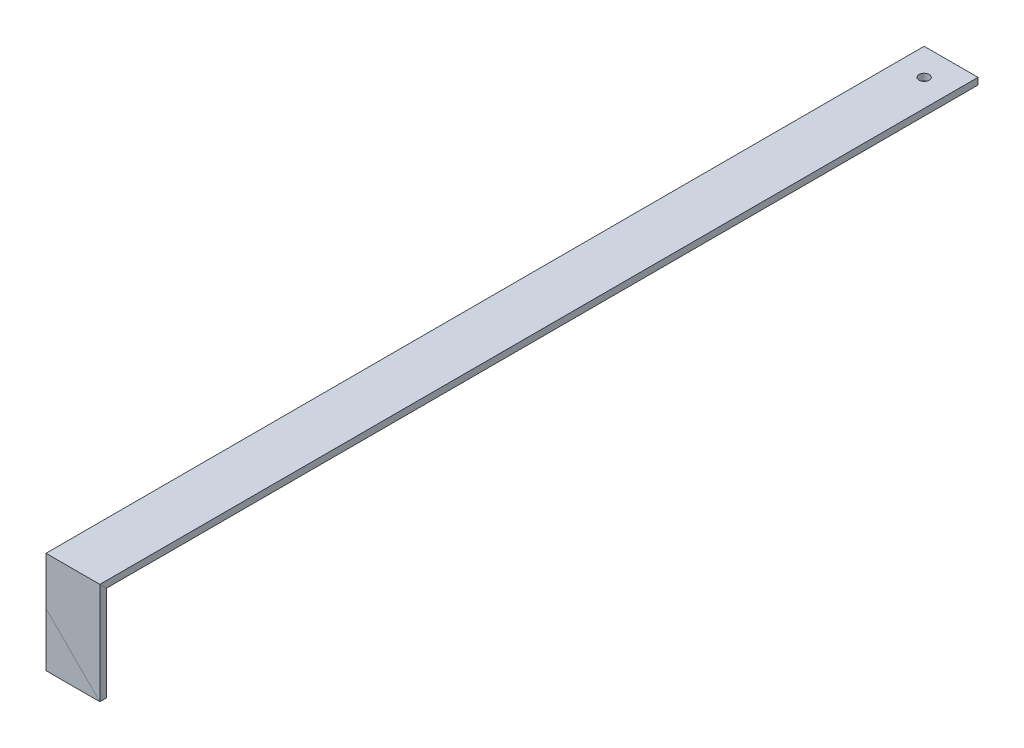
ISO-10303-21;
HEADER;
FILE_DESCRIPTION(('STEP AP214'),'2;1');
FILE_NAME('part.step','',(''),(''),'','','');
FILE_SCHEMA(('AUTOMOTIVE_DESIGN { 1 0 10303 214 1 1 1 1 }'));
ENDSEC;
DATA;
#1=APPLICATION_CONTEXT('core data for automotive mechanical design processes');
#2=APPLICATION_PROTOCOL_DEFINITION('international standard','automotive_design',2000,#1);
#3=PRODUCT_CONTEXT('',#1,'mechanical');
#4=PRODUCT('Part','Part','',(#3));
#5=PRODUCT_RELATED_PRODUCT_CATEGORY('part','',(#4));
#6=PRODUCT_DEFINITION_FORMATION('','',#4);
#7=PRODUCT_DEFINITION_CONTEXT('part definition',#1,'design');
#8=PRODUCT_DEFINITION('design','',#6,#7);
#9=PRODUCT_DEFINITION_SHAPE('','',#8);
#10=(LENGTH_UNIT() NAMED_UNIT(*) SI_UNIT(.MILLI.,.METRE.));
#11=(NAMED_UNIT(*) PLANE_ANGLE_UNIT() SI_UNIT($,.RADIAN.));
#12=(NAMED_UNIT(*) SI_UNIT($,.STERADIAN.) SOLID_ANGLE_UNIT());
#13=UNCERTAINTY_MEASURE_WITH_UNIT(LENGTH_MEASURE(1.E-05),#10,'distance_accuracy_value','');
#14=(GEOMETRIC_REPRESENTATION_CONTEXT(3) GLOBAL_UNCERTAINTY_ASSIGNED_CONTEXT((#13)) GLOBAL_UNIT_ASSIGNED_CONTEXT((#10,
#11,#12)) REPRESENTATION_CONTEXT('',''));
#15=CARTESIAN_POINT('',(0.,0.,0.));
#16=DIRECTION('',(0.,0.,1.));
#17=DIRECTION('',(1.,0.,0.));
#18=AXIS2_PLACEMENT_3D('',#15,#16,#17);
#19=CARTESIAN_POINT('',(28.0399999999999,-41.98,888.575));
#20=DIRECTION('',(0.,0.,-1.));
#21=DIRECTION('',(-1.,0.,0.));
#22=AXIS2_PLACEMENT_3D('',#19,#20,#21);
#23=PLANE('',#22);
#24=DIRECTION('',(0.,-1.,0.));
#25=VECTOR('',#24,1.);
#26=CARTESIAN_POINT('',(-25.4,-41.98,888.575));
#27=LINE('',#26,#25);
#28=CARTESIAN_POINT('',(-25.4,-41.98,888.575));
#29=VERTEX_POINT('',#28);
#30=CARTESIAN_POINT('',(-25.4,-92.78,888.575));
#31=VERTEX_POINT('',#30);
#32=EDGE_CURVE('E149',#29,#31,#27,.T.);
#33=ORIENTED_EDGE('',*,*,#32,.F.);
#34=DIRECTION('',(-0.707106781186548,0.707106781186548,0.));
#35=VECTOR('',#34,1.);
#36=CARTESIAN_POINT('',(-48.1752499999999,-19.2047500000001,888.575));
#37=LINE('',#36,#35);
#38=CARTESIAN_POINT('',(25.4,-92.78,888.575));
#39=VERTEX_POINT('',#38);
#40=EDGE_CURVE('E77',#39,#29,#37,.T.);
#41=ORIENTED_EDGE('',*,*,#40,.F.);
#42=DIRECTION('',(-1.,0.,0.));
#43=VECTOR('',#42,1.);
#44=CARTESIAN_POINT('',(28.04,-92.78,888.575));
#45=LINE('',#44,#43);
#46=EDGE_CURVE('E137',#39,#31,#45,.T.);
#47=ORIENTED_EDGE('',*,*,#46,.T.);
#48=EDGE_LOOP('',(#33,#41,#47));
#49=FACE_BOUND('',#48,.T.);
#50=ADVANCED_FACE('F34',(#49),#23,.T.);
#51=CARTESIAN_POINT('',(28.04,-92.78,894.885));
#52=DIRECTION('',(0.,-1.,0.));
#53=DIRECTION('',(0.,0.,-1.));
#54=AXIS2_PLACEMENT_3D('',#51,#52,#53);
#55=PLANE('',#54);
#56=DIRECTION('',(0.,0.,-1.));
#57=VECTOR('',#56,1.);
#58=CARTESIAN_POINT('',(-25.4,-92.78,894.885));
#59=LINE('',#58,#57);
#60=CARTESIAN_POINT('',(-25.4,-92.78,894.885));
#61=VERTEX_POINT('',#60);
#62=EDGE_CURVE('E148',#61,#31,#59,.T.);
#63=ORIENTED_EDGE('',*,*,#62,.T.);
#64=ORIENTED_EDGE('',*,*,#46,.F.);
#65=DIRECTION('',(0.,0.,-1.));
#66=VECTOR('',#65,1.);
#67=CARTESIAN_POINT('',(25.4,-92.78,894.885));
#68=LINE('',#67,#66);
#69=CARTESIAN_POINT('',(25.4,-92.78,894.885));
#70=VERTEX_POINT('',#69);
#71=EDGE_CURVE('E119',#70,#39,#68,.T.);
#72=ORIENTED_EDGE('',*,*,#71,.F.);
#73=DIRECTION('',(-1.,0.,0.));
#74=VECTOR('',#73,1.);
#75=CARTESIAN_POINT('',(28.04,-92.78,894.885));
#76=LINE('',#75,#74);
#77=EDGE_CURVE('E145',#70,#61,#76,.T.);
#78=ORIENTED_EDGE('',*,*,#77,.T.);
#79=EDGE_LOOP('',(#63,#64,#72,#78));
#80=FACE_BOUND('',#79,.T.);
#81=ADVANCED_FACE('F152',(#80),#55,.T.);
#82=CARTESIAN_POINT('',(28.04,-41.98,894.885));
#83=DIRECTION('',(0.,0.,1.));
#84=DIRECTION('',(1.,0.,0.));
#85=AXIS2_PLACEMENT_3D('',#82,#83,#84);
#86=PLANE('',#85);
#87=DIRECTION('',(0.,-1.,0.));
#88=VECTOR('',#87,1.);
#89=CARTESIAN_POINT('',(-25.4,-41.98,894.885));
#90=LINE('',#89,#88);
#91=CARTESIAN_POINT('',(-25.4,-41.98,894.885));
#92=VERTEX_POINT('',#91);
#93=EDGE_CURVE('E174',#92,#61,#90,.T.);
#94=ORIENTED_EDGE('',*,*,#93,.T.);
#95=ORIENTED_EDGE('',*,*,#77,.F.);
#96=DIRECTION('',(0.707106781186548,-0.707106781186548,0.));
#97=VECTOR('',#96,1.);
#98=CARTESIAN_POINT('',(-48.1752499999999,-19.2047500000001,894.885));
#99=LINE('',#98,#97);
#100=EDGE_CURVE('E129',#92,#70,#99,.T.);
#101=ORIENTED_EDGE('',*,*,#100,.F.);
#102=EDGE_LOOP('',(#94,#95,#101));
#103=FACE_BOUND('',#102,.T.);
#104=ADVANCED_FACE('F36',(#103),#86,.T.);
#105=CARTESIAN_POINT('',(-25.4,3.57049999999988,894.885));
#106=DIRECTION('',(0.,0.,1.));
#107=DIRECTION('',(1.,0.,0.));
#108=AXIS2_PLACEMENT_3D('',#105,#106,#107);
#109=PLANE('',#108);
#110=DIRECTION('',(0.,-1.,0.));
#111=VECTOR('',#110,1.);
#112=CARTESIAN_POINT('',(-25.4,3.57049999999988,894.885));
#113=LINE('',#112,#111);
#114=CARTESIAN_POINT('',(-25.4,3.155,894.885));
#115=VERTEX_POINT('',#114);
#116=EDGE_CURVE('E132',#115,#92,#113,.T.);
#117=ORIENTED_EDGE('',*,*,#116,.T.);
#118=ORIENTED_EDGE('',*,*,#100,.T.);
#119=DIRECTION('',(0.,-1.,0.));
#120=VECTOR('',#119,1.);
#121=CARTESIAN_POINT('',(25.4,3.57049999999988,894.885));
#122=LINE('',#121,#120);
#123=CARTESIAN_POINT('',(25.4,3.155,894.885));
#124=VERTEX_POINT('',#123);
#125=EDGE_CURVE('E133',#124,#70,#122,.T.);
#126=ORIENTED_EDGE('',*,*,#125,.F.);
#127=DIRECTION('',(1.,0.,0.));
#128=VECTOR('',#127,1.);
#129=CARTESIAN_POINT('',(-25.4,3.155,894.885));
#130=LINE('',#129,#128);
#131=EDGE_CURVE('E125',#115,#124,#130,.T.);
#132=ORIENTED_EDGE('',*,*,#131,.F.);
#133=EDGE_LOOP('',(#117,#118,#126,#132));
#134=FACE_BOUND('',#133,.T.);
#135=ADVANCED_FACE('F170',(#134),#109,.T.);
#136=CARTESIAN_POINT('',(25.4,3.57049999999988,894.885));
#137=DIRECTION('',(1.,0.,0.));
#138=DIRECTION('',(0.,0.,-1.));
#139=AXIS2_PLACEMENT_3D('',#136,#137,#138);
#140=PLANE('',#139);
#141=ORIENTED_EDGE('',*,*,#125,.T.);
#142=ORIENTED_EDGE('',*,*,#71,.T.);
#143=DIRECTION('',(0.,-1.,0.));
#144=VECTOR('',#143,1.);
#145=CARTESIAN_POINT('',(25.4,3.57049999999988,888.575));
#146=LINE('',#145,#144);
#147=CARTESIAN_POINT('',(25.4,-3.15500000000007,888.575));
#148=VERTEX_POINT('',#147);
#149=EDGE_CURVE('E136',#148,#39,#146,.T.);
#150=ORIENTED_EDGE('',*,*,#149,.F.);
#151=DIRECTION('',(0.,-0.707106781186548,-0.707106781186548));
#152=VECTOR('',#151,1.);
#153=CARTESIAN_POINT('',(25.4,-444.2875,447.4425));
#154=LINE('',#153,#152);
#155=EDGE_CURVE('E163',#124,#148,#154,.T.);
#156=ORIENTED_EDGE('',*,*,#155,.F.);
#157=EDGE_LOOP('',(#141,#142,#150,#156));
#158=FACE_BOUND('',#157,.T.);
#159=ADVANCED_FACE('F156',(#158),#140,.T.);
#160=CARTESIAN_POINT('',(-25.4,3.57049999999988,888.575));
#161=DIRECTION('',(0.,0.,-1.));
#162=DIRECTION('',(-1.,0.,0.));
#163=AXIS2_PLACEMENT_3D('',#160,#161,#162);
#164=PLANE('',#163);
#165=ORIENTED_EDGE('',*,*,#149,.T.);
#166=ORIENTED_EDGE('',*,*,#40,.T.);
#167=DIRECTION('',(0.,-1.,0.));
#168=VECTOR('',#167,1.);
#169=CARTESIAN_POINT('',(-25.4,3.57049999999988,888.575));
#170=LINE('',#169,#168);
#171=CARTESIAN_POINT('',(-25.4,-3.15500000000004,888.575));
#172=VERTEX_POINT('',#171);
#173=EDGE_CURVE('E140',#172,#29,#170,.T.);
#174=ORIENTED_EDGE('',*,*,#173,.F.);
#175=DIRECTION('',(-1.,0.,0.));
#176=VECTOR('',#175,1.);
#177=CARTESIAN_POINT('',(-25.4,-3.155,888.575));
#178=LINE('',#177,#176);
#179=EDGE_CURVE('E43',#148,#172,#178,.T.);
#180=ORIENTED_EDGE('',*,*,#179,.F.);
#181=EDGE_LOOP('',(#165,#166,#174,#180));
#182=FACE_BOUND('',#181,.T.);
#183=ADVANCED_FACE('F161',(#182),#164,.T.);
#184=CARTESIAN_POINT('',(-25.4,3.57049999999988,894.885));
#185=DIRECTION('',(-1.,0.,0.));
#186=DIRECTION('',(0.,0.,1.));
#187=AXIS2_PLACEMENT_3D('',#184,#185,#186);
#188=PLANE('',#187);
#189=ORIENTED_EDGE('',*,*,#173,.T.);
#190=ORIENTED_EDGE('',*,*,#32,.T.);
#191=ORIENTED_EDGE('',*,*,#62,.F.);
#192=ORIENTED_EDGE('',*,*,#93,.F.);
#193=ORIENTED_EDGE('',*,*,#116,.F.);
#194=DIRECTION('',(0.,0.707106781186548,0.707106781186548));
#195=VECTOR('',#194,1.);
#196=CARTESIAN_POINT('',(-25.4,-444.2875,447.4425));
#197=LINE('',#196,#195);
#198=EDGE_CURVE('E116',#172,#115,#197,.T.);
#199=ORIENTED_EDGE('',*,*,#198,.F.);
#200=EDGE_LOOP('',(#189,#190,#191,#192,#193,#199));
#201=FACE_BOUND('',#200,.T.);
#202=ADVANCED_FACE('F172',(#201),#188,.T.);
#203=CARTESIAN_POINT('',(-25.4,3.155,0.));
#204=DIRECTION('',(0.,1.,0.));
#205=DIRECTION('',(0.,0.,1.));
#206=AXIS2_PLACEMENT_3D('',#203,#204,#205);
#207=PLANE('',#206);
#208=CARTESIAN_POINT('',(0.,3.155,91.6));
#209=DIRECTION('',(0.,1.,0.));
#210=DIRECTION('',(0.,0.,1.));
#211=AXIS2_PLACEMENT_3D('',#208,#209,#210);
#212=CIRCLE('',#211,4.7625);
#213=CARTESIAN_POINT('',(0.,3.155,96.3625));
#214=VERTEX_POINT('',#213);
#215=EDGE_CURVE('E287',#214,#214,#212,.T.);
#216=ORIENTED_EDGE('',*,*,#215,.F.);
#217=EDGE_LOOP('',(#216));
#218=FACE_BOUND('',#217,.T.);
#219=DIRECTION('',(1.,0.,0.));
#220=VECTOR('',#219,1.);
#221=CARTESIAN_POINT('',(25.4,3.155,66.2));
#222=LINE('',#221,#220);
#223=CARTESIAN_POINT('',(-25.4,3.155,66.2));
#224=VERTEX_POINT('',#223);
#225=CARTESIAN_POINT('',(25.4,3.155,66.2));
#226=VERTEX_POINT('',#225);
#227=EDGE_CURVE('E103',#224,#226,#222,.T.);
#228=ORIENTED_EDGE('',*,*,#227,.F.);
#229=DIRECTION('',(0.,0.,1.));
#230=VECTOR('',#229,1.);
#231=CARTESIAN_POINT('',(-25.4,3.155,0.));
#232=LINE('',#231,#230);
#233=EDGE_CURVE('E110',#224,#115,#232,.T.);
#234=ORIENTED_EDGE('',*,*,#233,.T.);
#235=ORIENTED_EDGE('',*,*,#131,.T.);
#236=DIRECTION('',(0.,0.,1.));
#237=VECTOR('',#236,1.);
#238=CARTESIAN_POINT('',(25.4,3.155,0.));
#239=LINE('',#238,#237);
#240=EDGE_CURVE('E112',#226,#124,#239,.T.);
#241=ORIENTED_EDGE('',*,*,#240,.F.);
#242=EDGE_LOOP('',(#228,#234,#235,#241));
#243=FACE_BOUND('',#242,.T.);
#244=ADVANCED_FACE('F108',(#218,#243),#207,.T.);
#245=CARTESIAN_POINT('',(25.4,3.155,0.));
#246=DIRECTION('',(1.,0.,0.));
#247=DIRECTION('',(0.,0.,-1.));
#248=AXIS2_PLACEMENT_3D('',#245,#246,#247);
#249=PLANE('',#248);
#250=DIRECTION('',(0.,1.,0.));
#251=VECTOR('',#250,1.);
#252=CARTESIAN_POINT('',(25.4,-6.845,66.2));
#253=LINE('',#252,#251);
#254=CARTESIAN_POINT('',(25.4,-3.155,66.2));
#255=VERTEX_POINT('',#254);
#256=EDGE_CURVE('E113',#255,#226,#253,.T.);
#257=ORIENTED_EDGE('',*,*,#256,.T.);
#258=ORIENTED_EDGE('',*,*,#240,.T.);
#259=ORIENTED_EDGE('',*,*,#155,.T.);
#260=DIRECTION('',(0.,0.,1.));
#261=VECTOR('',#260,1.);
#262=CARTESIAN_POINT('',(25.4,-3.155,0.));
#263=LINE('',#262,#261);
#264=EDGE_CURVE('E57',#255,#148,#263,.T.);
#265=ORIENTED_EDGE('',*,*,#264,.F.);
#266=EDGE_LOOP('',(#257,#258,#259,#265));
#267=FACE_BOUND('',#266,.T.);
#268=ADVANCED_FACE('F193',(#267),#249,.T.);
#269=CARTESIAN_POINT('',(-25.4,-3.155,0.));
#270=DIRECTION('',(0.,-1.,0.));
#271=DIRECTION('',(0.,0.,-1.));
#272=AXIS2_PLACEMENT_3D('',#269,#270,#271);
#273=PLANE('',#272);
#274=CARTESIAN_POINT('',(0.,-3.155,91.6));
#275=DIRECTION('',(0.,-1.,0.));
#276=DIRECTION('',(0.,0.,-1.));
#277=AXIS2_PLACEMENT_3D('',#274,#275,#276);
#278=CIRCLE('',#277,4.7625);
#279=CARTESIAN_POINT('',(0.,-3.155,86.8375));
#280=VERTEX_POINT('',#279);
#281=EDGE_CURVE('E38',#280,#280,#278,.T.);
#282=ORIENTED_EDGE('',*,*,#281,.F.);
#283=EDGE_LOOP('',(#282));
#284=FACE_BOUND('',#283,.T.);
#285=DIRECTION('',(-1.,0.,0.));
#286=VECTOR('',#285,1.);
#287=CARTESIAN_POINT('',(-25.4,-3.155,66.2));
#288=LINE('',#287,#286);
#289=CARTESIAN_POINT('',(-25.4,-3.155,66.2));
#290=VERTEX_POINT('',#289);
#291=EDGE_CURVE('E49',#255,#290,#288,.T.);
#292=ORIENTED_EDGE('',*,*,#291,.F.);
#293=ORIENTED_EDGE('',*,*,#264,.T.);
#294=ORIENTED_EDGE('',*,*,#179,.T.);
#295=DIRECTION('',(0.,0.,1.));
#296=VECTOR('',#295,1.);
#297=CARTESIAN_POINT('',(-25.4,-3.155,0.));
#298=LINE('',#297,#296);
#299=EDGE_CURVE('E84',#290,#172,#298,.T.);
#300=ORIENTED_EDGE('',*,*,#299,.F.);
#301=EDGE_LOOP('',(#292,#293,#294,#300));
#302=FACE_BOUND('',#301,.T.);
#303=ADVANCED_FACE('F185',(#284,#302),#273,.T.);
#304=CARTESIAN_POINT('',(-25.4,3.155,0.));
#305=DIRECTION('',(-1.,0.,0.));
#306=DIRECTION('',(0.,0.,1.));
#307=AXIS2_PLACEMENT_3D('',#304,#305,#306);
#308=PLANE('',#307);
#309=DIRECTION('',(0.,1.,0.));
#310=VECTOR('',#309,1.);
#311=CARTESIAN_POINT('',(-25.4,3.155,66.2));
#312=LINE('',#311,#310);
#313=EDGE_CURVE('E11',#290,#224,#312,.T.);
#314=ORIENTED_EDGE('',*,*,#313,.F.);
#315=ORIENTED_EDGE('',*,*,#299,.T.);
#316=ORIENTED_EDGE('',*,*,#198,.T.);
#317=ORIENTED_EDGE('',*,*,#233,.F.);
#318=EDGE_LOOP('',(#314,#315,#316,#317));
#319=FACE_BOUND('',#318,.T.);
#320=ADVANCED_FACE('F115',(#319),#308,.T.);
#321=CARTESIAN_POINT('',(25.4,-6.845,66.2));
#322=DIRECTION('',(0.,0.,1.));
#323=DIRECTION('',(1.,0.,0.));
#324=AXIS2_PLACEMENT_3D('',#321,#322,#323);
#325=PLANE('',#324);
#326=ORIENTED_EDGE('',*,*,#291,.T.);
#327=ORIENTED_EDGE('',*,*,#313,.T.);
#328=ORIENTED_EDGE('',*,*,#227,.T.);
#329=ORIENTED_EDGE('',*,*,#256,.F.);
#330=EDGE_LOOP('',(#326,#327,#328,#329));
#331=FACE_BOUND('',#330,.T.);
#332=ADVANCED_FACE('F102',(#331),#325,.F.);
#333=CARTESIAN_POINT('',(0.,-6.845,91.6));
#334=DIRECTION('',(0.,1.,0.));
#335=DIRECTION('',(0.,0.,1.));
#336=AXIS2_PLACEMENT_3D('',#333,#334,#335);
#337=CYLINDRICAL_SURFACE('',#336,4.7625);
#338=ORIENTED_EDGE('',*,*,#281,.T.);
#339=EDGE_LOOP('',(#338));
#340=FACE_BOUND('',#339,.T.);
#341=ORIENTED_EDGE('',*,*,#215,.T.);
#342=EDGE_LOOP('',(#341));
#343=FACE_BOUND('',#342,.T.);
#344=ADVANCED_FACE('F191',(#340,#343),#337,.F.);
#345=CLOSED_SHELL('',(#50,#81,#104,#135,#159,#183,#202,#244,#268,#303,#320,#332,#344));
#346=MANIFOLD_SOLID_BREP('B2',#345);
#347=ADVANCED_BREP_SHAPE_REPRESENTATION('',(#18,#346),#14);
#348=SHAPE_DEFINITION_REPRESENTATION(#9,#347);
ENDSEC;
END-ISO-10303-21;
